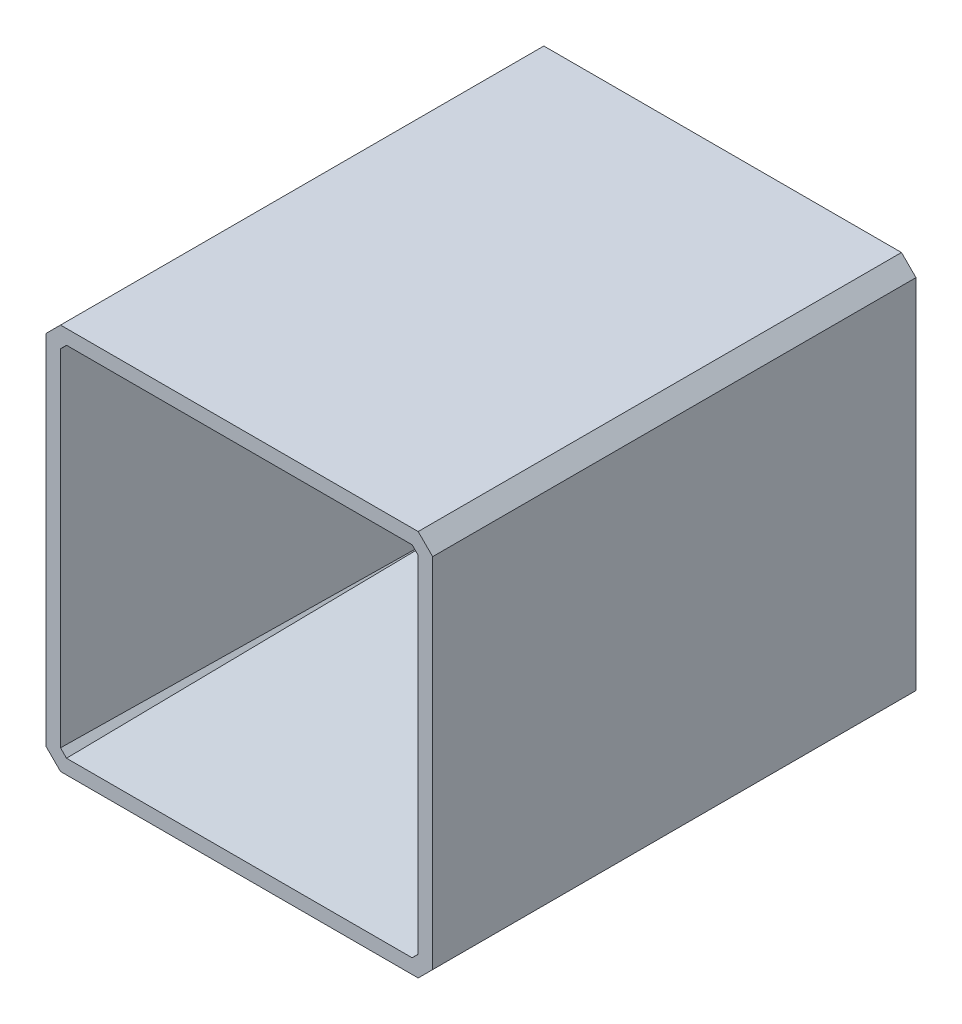
ISO-10303-21;
HEADER;
FILE_DESCRIPTION(('STEP AP214'),'2;1');
FILE_NAME('part.step','',(''),(''),'','','');
FILE_SCHEMA(('AUTOMOTIVE_DESIGN { 1 0 10303 214 1 1 1 1 }'));
ENDSEC;
DATA;
#1=APPLICATION_CONTEXT('core data for automotive mechanical design processes');
#2=APPLICATION_PROTOCOL_DEFINITION('international standard','automotive_design',2000,#1);
#3=PRODUCT_CONTEXT('',#1,'mechanical');
#4=PRODUCT('Part','Part','',(#3));
#5=PRODUCT_RELATED_PRODUCT_CATEGORY('part','',(#4));
#6=PRODUCT_DEFINITION_FORMATION('','',#4);
#7=PRODUCT_DEFINITION_CONTEXT('part definition',#1,'design');
#8=PRODUCT_DEFINITION('design','',#6,#7);
#9=PRODUCT_DEFINITION_SHAPE('','',#8);
#10=(LENGTH_UNIT() NAMED_UNIT(*) SI_UNIT(.MILLI.,.METRE.));
#11=(NAMED_UNIT(*) PLANE_ANGLE_UNIT() SI_UNIT($,.RADIAN.));
#12=(NAMED_UNIT(*) SI_UNIT($,.STERADIAN.) SOLID_ANGLE_UNIT());
#13=UNCERTAINTY_MEASURE_WITH_UNIT(LENGTH_MEASURE(1.E-05),#10,'distance_accuracy_value','');
#14=(GEOMETRIC_REPRESENTATION_CONTEXT(3) GLOBAL_UNCERTAINTY_ASSIGNED_CONTEXT((#13)) GLOBAL_UNIT_ASSIGNED_CONTEXT((#10,
#11,#12)) REPRESENTATION_CONTEXT('',''));
#15=CARTESIAN_POINT('',(0.,0.,0.));
#16=DIRECTION('',(0.,0.,1.));
#17=DIRECTION('',(1.,0.,0.));
#18=AXIS2_PLACEMENT_3D('',#15,#16,#17);
#19=CARTESIAN_POINT('',(40.,40.,100.));
#20=DIRECTION('',(0.,-1.,0.));
#21=DIRECTION('',(0.,0.,-1.));
#22=AXIS2_PLACEMENT_3D('',#19,#20,#21);
#23=PLANE('',#22);
#24=DIRECTION('',(-1.,0.,0.));
#25=VECTOR('',#24,1.);
#26=CARTESIAN_POINT('',(40.,40.,100.));
#27=LINE('',#26,#25);
#28=CARTESIAN_POINT('',(37.,40.,100.));
#29=VERTEX_POINT('',#28);
#30=CARTESIAN_POINT('',(-37.,40.,100.));
#31=VERTEX_POINT('',#30);
#32=EDGE_CURVE('E197',#29,#31,#27,.T.);
#33=ORIENTED_EDGE('',*,*,#32,.F.);
#34=DIRECTION('',(0.,0.,-1.));
#35=VECTOR('',#34,1.);
#36=CARTESIAN_POINT('',(37.,40.,100.));
#37=LINE('',#36,#35);
#38=CARTESIAN_POINT('',(37.,40.,0.));
#39=VERTEX_POINT('',#38);
#40=EDGE_CURVE('E222',#29,#39,#37,.T.);
#41=ORIENTED_EDGE('',*,*,#40,.T.);
#42=DIRECTION('',(-1.,0.,0.));
#43=VECTOR('',#42,1.);
#44=CARTESIAN_POINT('',(40.,40.,0.));
#45=LINE('',#44,#43);
#46=CARTESIAN_POINT('',(-37.,40.,0.));
#47=VERTEX_POINT('',#46);
#48=EDGE_CURVE('E210',#39,#47,#45,.T.);
#49=ORIENTED_EDGE('',*,*,#48,.T.);
#50=DIRECTION('',(0.,0.,1.));
#51=VECTOR('',#50,1.);
#52=CARTESIAN_POINT('',(-37.,40.,100.));
#53=LINE('',#52,#51);
#54=EDGE_CURVE('E209',#47,#31,#53,.T.);
#55=ORIENTED_EDGE('',*,*,#54,.T.);
#56=EDGE_LOOP('',(#33,#41,#49,#55));
#57=FACE_BOUND('',#56,.T.);
#58=ADVANCED_FACE('F45',(#57),#23,.F.);
#59=CARTESIAN_POINT('',(-40.,-40.,100.));
#60=DIRECTION('',(1.,0.,0.));
#61=DIRECTION('',(0.,0.,-1.));
#62=AXIS2_PLACEMENT_3D('',#59,#60,#61);
#63=PLANE('',#62);
#64=DIRECTION('',(0.,-1.,0.));
#65=VECTOR('',#64,1.);
#66=CARTESIAN_POINT('',(-40.,-40.,0.));
#67=LINE('',#66,#65);
#68=CARTESIAN_POINT('',(-40.,37.,0.));
#69=VERTEX_POINT('',#68);
#70=CARTESIAN_POINT('',(-40.,-37.,0.));
#71=VERTEX_POINT('',#70);
#72=EDGE_CURVE('E213',#69,#71,#67,.T.);
#73=ORIENTED_EDGE('',*,*,#72,.T.);
#74=DIRECTION('',(0.,0.,1.));
#75=VECTOR('',#74,1.);
#76=CARTESIAN_POINT('',(-40.,-37.,100.));
#77=LINE('',#76,#75);
#78=CARTESIAN_POINT('',(-40.,-37.,100.));
#79=VERTEX_POINT('',#78);
#80=EDGE_CURVE('E12',#71,#79,#77,.T.);
#81=ORIENTED_EDGE('',*,*,#80,.T.);
#82=DIRECTION('',(0.,-1.,0.));
#83=VECTOR('',#82,1.);
#84=CARTESIAN_POINT('',(-40.,-40.,100.));
#85=LINE('',#84,#83);
#86=CARTESIAN_POINT('',(-40.,37.,100.));
#87=VERTEX_POINT('',#86);
#88=EDGE_CURVE('E200',#87,#79,#85,.T.);
#89=ORIENTED_EDGE('',*,*,#88,.F.);
#90=DIRECTION('',(0.,0.,-1.));
#91=VECTOR('',#90,1.);
#92=CARTESIAN_POINT('',(-40.,37.,100.));
#93=LINE('',#92,#91);
#94=EDGE_CURVE('E54',#87,#69,#93,.T.);
#95=ORIENTED_EDGE('',*,*,#94,.T.);
#96=EDGE_LOOP('',(#73,#81,#89,#95));
#97=FACE_BOUND('',#96,.T.);
#98=ADVANCED_FACE('F254',(#97),#63,.F.);
#99=CARTESIAN_POINT('',(40.,-40.,100.));
#100=DIRECTION('',(0.,1.,0.));
#101=DIRECTION('',(0.,0.,1.));
#102=AXIS2_PLACEMENT_3D('',#99,#100,#101);
#103=PLANE('',#102);
#104=DIRECTION('',(1.,0.,0.));
#105=VECTOR('',#104,1.);
#106=CARTESIAN_POINT('',(40.,-40.,0.));
#107=LINE('',#106,#105);
#108=CARTESIAN_POINT('',(-37.,-40.,0.));
#109=VERTEX_POINT('',#108);
#110=CARTESIAN_POINT('',(37.,-40.,0.));
#111=VERTEX_POINT('',#110);
#112=EDGE_CURVE('E217',#109,#111,#107,.T.);
#113=ORIENTED_EDGE('',*,*,#112,.T.);
#114=DIRECTION('',(0.,0.,1.));
#115=VECTOR('',#114,1.);
#116=CARTESIAN_POINT('',(37.,-40.,100.));
#117=LINE('',#116,#115);
#118=CARTESIAN_POINT('',(37.,-40.,100.));
#119=VERTEX_POINT('',#118);
#120=EDGE_CURVE('E69',#111,#119,#117,.T.);
#121=ORIENTED_EDGE('',*,*,#120,.T.);
#122=DIRECTION('',(1.,0.,0.));
#123=VECTOR('',#122,1.);
#124=CARTESIAN_POINT('',(40.,-40.,100.));
#125=LINE('',#124,#123);
#126=CARTESIAN_POINT('',(-37.,-40.,100.));
#127=VERTEX_POINT('',#126);
#128=EDGE_CURVE('E204',#127,#119,#125,.T.);
#129=ORIENTED_EDGE('',*,*,#128,.F.);
#130=DIRECTION('',(0.,0.,-1.));
#131=VECTOR('',#130,1.);
#132=CARTESIAN_POINT('',(-37.,-40.,100.));
#133=LINE('',#132,#131);
#134=EDGE_CURVE('E246',#127,#109,#133,.T.);
#135=ORIENTED_EDGE('',*,*,#134,.T.);
#136=EDGE_LOOP('',(#113,#121,#129,#135));
#137=FACE_BOUND('',#136,.T.);
#138=ADVANCED_FACE('F266',(#137),#103,.F.);
#139=CARTESIAN_POINT('',(40.,-40.,100.));
#140=DIRECTION('',(-1.,0.,0.));
#141=DIRECTION('',(0.,0.,1.));
#142=AXIS2_PLACEMENT_3D('',#139,#140,#141);
#143=PLANE('',#142);
#144=DIRECTION('',(0.,1.,0.));
#145=VECTOR('',#144,1.);
#146=CARTESIAN_POINT('',(40.,-40.,0.));
#147=LINE('',#146,#145);
#148=CARTESIAN_POINT('',(40.,-37.,0.));
#149=VERTEX_POINT('',#148);
#150=CARTESIAN_POINT('',(40.,37.,0.));
#151=VERTEX_POINT('',#150);
#152=EDGE_CURVE('E201',#149,#151,#147,.T.);
#153=ORIENTED_EDGE('',*,*,#152,.T.);
#154=DIRECTION('',(0.,0.,1.));
#155=VECTOR('',#154,1.);
#156=CARTESIAN_POINT('',(40.,37.,100.));
#157=LINE('',#156,#155);
#158=CARTESIAN_POINT('',(40.,37.,100.));
#159=VERTEX_POINT('',#158);
#160=EDGE_CURVE('E236',#151,#159,#157,.T.);
#161=ORIENTED_EDGE('',*,*,#160,.T.);
#162=DIRECTION('',(0.,1.,0.));
#163=VECTOR('',#162,1.);
#164=CARTESIAN_POINT('',(40.,-40.,100.));
#165=LINE('',#164,#163);
#166=CARTESIAN_POINT('',(40.,-37.,100.));
#167=VERTEX_POINT('',#166);
#168=EDGE_CURVE('E206',#167,#159,#165,.T.);
#169=ORIENTED_EDGE('',*,*,#168,.F.);
#170=DIRECTION('',(0.,0.,-1.));
#171=VECTOR('',#170,1.);
#172=CARTESIAN_POINT('',(40.,-37.,100.));
#173=LINE('',#172,#171);
#174=EDGE_CURVE('E233',#167,#149,#173,.T.);
#175=ORIENTED_EDGE('',*,*,#174,.T.);
#176=EDGE_LOOP('',(#153,#161,#169,#175));
#177=FACE_BOUND('',#176,.T.);
#178=ADVANCED_FACE('F276',(#177),#143,.F.);
#179=CARTESIAN_POINT('',(0.,0.,100.));
#180=DIRECTION('',(0.,0.,-1.));
#181=DIRECTION('',(-1.,0.,0.));
#182=AXIS2_PLACEMENT_3D('',#179,#180,#181);
#183=PLANE('',#182);
#184=DIRECTION('',(1.,0.,0.));
#185=VECTOR('',#184,1.);
#186=CARTESIAN_POINT('',(-35.7573593128807,-37.,100.));
#187=LINE('',#186,#185);
#188=CARTESIAN_POINT('',(-35.7573593128807,-37.,100.));
#189=VERTEX_POINT('',#188);
#190=CARTESIAN_POINT('',(35.7573593128807,-37.,100.));
#191=VERTEX_POINT('',#190);
#192=EDGE_CURVE('E214',#189,#191,#187,.T.);
#193=ORIENTED_EDGE('',*,*,#192,.F.);
#194=DIRECTION('',(0.707106781186547,-0.707106781186547,0.));
#195=VECTOR('',#194,1.);
#196=CARTESIAN_POINT('',(-37.,-35.7573593128807,100.));
#197=LINE('',#196,#195);
#198=CARTESIAN_POINT('',(-37.,-35.7573593128807,100.));
#199=VERTEX_POINT('',#198);
#200=EDGE_CURVE('E465',#199,#189,#197,.T.);
#201=ORIENTED_EDGE('',*,*,#200,.F.);
#202=DIRECTION('',(0.,-1.,0.));
#203=VECTOR('',#202,1.);
#204=CARTESIAN_POINT('',(-37.,35.7573593128807,100.));
#205=LINE('',#204,#203);
#206=CARTESIAN_POINT('',(-37.,35.7573593128807,100.));
#207=VERTEX_POINT('',#206);
#208=EDGE_CURVE('E469',#207,#199,#205,.T.);
#209=ORIENTED_EDGE('',*,*,#208,.F.);
#210=DIRECTION('',(-0.707106781186547,-0.707106781186547,0.));
#211=VECTOR('',#210,1.);
#212=CARTESIAN_POINT('',(-35.7573593128807,37.,100.));
#213=LINE('',#212,#211);
#214=CARTESIAN_POINT('',(-35.7573593128807,37.,100.));
#215=VERTEX_POINT('',#214);
#216=EDGE_CURVE('E476',#215,#207,#213,.T.);
#217=ORIENTED_EDGE('',*,*,#216,.F.);
#218=DIRECTION('',(-1.,0.,0.));
#219=VECTOR('',#218,1.);
#220=CARTESIAN_POINT('',(35.7573593128807,37.,100.));
#221=LINE('',#220,#219);
#222=CARTESIAN_POINT('',(35.7573593128807,37.,100.));
#223=VERTEX_POINT('',#222);
#224=EDGE_CURVE('E479',#223,#215,#221,.T.);
#225=ORIENTED_EDGE('',*,*,#224,.F.);
#226=DIRECTION('',(-0.707106781186547,0.707106781186547,0.));
#227=VECTOR('',#226,1.);
#228=CARTESIAN_POINT('',(37.,35.7573593128807,100.));
#229=LINE('',#228,#227);
#230=CARTESIAN_POINT('',(37.,35.7573593128807,100.));
#231=VERTEX_POINT('',#230);
#232=EDGE_CURVE('E482',#231,#223,#229,.T.);
#233=ORIENTED_EDGE('',*,*,#232,.F.);
#234=DIRECTION('',(0.,1.,0.));
#235=VECTOR('',#234,1.);
#236=CARTESIAN_POINT('',(37.,-35.7573593128807,100.));
#237=LINE('',#236,#235);
#238=CARTESIAN_POINT('',(37.,-35.7573593128807,100.));
#239=VERTEX_POINT('',#238);
#240=EDGE_CURVE('E61',#239,#231,#237,.T.);
#241=ORIENTED_EDGE('',*,*,#240,.F.);
#242=DIRECTION('',(0.707106781186547,0.707106781186547,0.));
#243=VECTOR('',#242,1.);
#244=CARTESIAN_POINT('',(35.7573593128807,-37.,100.));
#245=LINE('',#244,#243);
#246=EDGE_CURVE('E186',#191,#239,#245,.T.);
#247=ORIENTED_EDGE('',*,*,#246,.F.);
#248=EDGE_LOOP('',(#193,#201,#209,#217,#225,#233,#241,#247));
#249=FACE_BOUND('',#248,.T.);
#250=ORIENTED_EDGE('',*,*,#168,.T.);
#251=DIRECTION('',(0.707106781186546,-0.707106781186549,0.));
#252=VECTOR('',#251,1.);
#253=CARTESIAN_POINT('',(37.,40.,100.));
#254=LINE('',#253,#252);
#255=EDGE_CURVE('E244',#159,#29,#254,.F.);
#256=ORIENTED_EDGE('',*,*,#255,.T.);
#257=ORIENTED_EDGE('',*,*,#32,.T.);
#258=DIRECTION('',(0.707106781186549,0.707106781186546,0.));
#259=VECTOR('',#258,1.);
#260=CARTESIAN_POINT('',(-40.,37.,100.));
#261=LINE('',#260,#259);
#262=EDGE_CURVE('E238',#31,#87,#261,.F.);
#263=ORIENTED_EDGE('',*,*,#262,.T.);
#264=ORIENTED_EDGE('',*,*,#88,.T.);
#265=DIRECTION('',(-0.707106781186548,0.707106781186548,0.));
#266=VECTOR('',#265,1.);
#267=CARTESIAN_POINT('',(-37.,-40.,100.));
#268=LINE('',#267,#266);
#269=EDGE_CURVE('E240',#79,#127,#268,.F.);
#270=ORIENTED_EDGE('',*,*,#269,.T.);
#271=ORIENTED_EDGE('',*,*,#128,.T.);
#272=DIRECTION('',(-0.707106781186549,-0.707106781186546,0.));
#273=VECTOR('',#272,1.);
#274=CARTESIAN_POINT('',(40.,-37.,100.));
#275=LINE('',#274,#273);
#276=EDGE_CURVE('E242',#119,#167,#275,.F.);
#277=ORIENTED_EDGE('',*,*,#276,.T.);
#278=EDGE_LOOP('',(#250,#256,#257,#263,#264,#270,#271,#277));
#279=FACE_BOUND('',#278,.T.);
#280=ADVANCED_FACE('F269',(#249,#279),#183,.F.);
#281=CARTESIAN_POINT('',(0.,0.,0.));
#282=DIRECTION('',(0.,0.,-1.));
#283=DIRECTION('',(-1.,0.,0.));
#284=AXIS2_PLACEMENT_3D('',#281,#282,#283);
#285=PLANE('',#284);
#286=ORIENTED_EDGE('',*,*,#48,.F.);
#287=DIRECTION('',(-0.707106781186546,0.707106781186549,0.));
#288=VECTOR('',#287,1.);
#289=CARTESIAN_POINT('',(38.5000000000001,38.4999999999999,0.));
#290=LINE('',#289,#288);
#291=EDGE_CURVE('E231',#39,#151,#290,.F.);
#292=ORIENTED_EDGE('',*,*,#291,.T.);
#293=ORIENTED_EDGE('',*,*,#152,.F.);
#294=DIRECTION('',(0.707106781186549,0.707106781186546,0.));
#295=VECTOR('',#294,1.);
#296=CARTESIAN_POINT('',(38.4999999999999,-38.5000000000001,0.));
#297=LINE('',#296,#295);
#298=EDGE_CURVE('E229',#149,#111,#297,.F.);
#299=ORIENTED_EDGE('',*,*,#298,.T.);
#300=ORIENTED_EDGE('',*,*,#112,.F.);
#301=DIRECTION('',(0.707106781186548,-0.707106781186548,0.));
#302=VECTOR('',#301,1.);
#303=CARTESIAN_POINT('',(-38.5,-38.5,0.));
#304=LINE('',#303,#302);
#305=EDGE_CURVE('E227',#109,#71,#304,.F.);
#306=ORIENTED_EDGE('',*,*,#305,.T.);
#307=ORIENTED_EDGE('',*,*,#72,.F.);
#308=DIRECTION('',(-0.707106781186549,-0.707106781186546,0.));
#309=VECTOR('',#308,1.);
#310=CARTESIAN_POINT('',(-38.4999999999999,38.5000000000001,0.));
#311=LINE('',#310,#309);
#312=EDGE_CURVE('E225',#69,#47,#311,.F.);
#313=ORIENTED_EDGE('',*,*,#312,.T.);
#314=EDGE_LOOP('',(#286,#292,#293,#299,#300,#306,#307,#313));
#315=FACE_BOUND('',#314,.T.);
#316=ADVANCED_FACE('F260',(#315),#285,.T.);
#317=CARTESIAN_POINT('',(37.,40.,100.));
#318=DIRECTION('',(-0.707106781186549,-0.707106781186546,0.));
#319=DIRECTION('',(0.,0.,-1.));
#320=AXIS2_PLACEMENT_3D('',#317,#318,#319);
#321=PLANE('',#320);
#322=ORIENTED_EDGE('',*,*,#255,.F.);
#323=ORIENTED_EDGE('',*,*,#160,.F.);
#324=ORIENTED_EDGE('',*,*,#291,.F.);
#325=ORIENTED_EDGE('',*,*,#40,.F.);
#326=EDGE_LOOP('',(#322,#323,#324,#325));
#327=FACE_BOUND('',#326,.T.);
#328=ADVANCED_FACE('F281',(#327),#321,.F.);
#329=CARTESIAN_POINT('',(40.,-37.,100.));
#330=DIRECTION('',(-0.707106781186546,0.707106781186549,0.));
#331=DIRECTION('',(0.,0.,-1.));
#332=AXIS2_PLACEMENT_3D('',#329,#330,#331);
#333=PLANE('',#332);
#334=ORIENTED_EDGE('',*,*,#276,.F.);
#335=ORIENTED_EDGE('',*,*,#120,.F.);
#336=ORIENTED_EDGE('',*,*,#298,.F.);
#337=ORIENTED_EDGE('',*,*,#174,.F.);
#338=EDGE_LOOP('',(#334,#335,#336,#337));
#339=FACE_BOUND('',#338,.T.);
#340=ADVANCED_FACE('F273',(#339),#333,.F.);
#341=CARTESIAN_POINT('',(-37.,-40.,100.));
#342=DIRECTION('',(0.707106781186547,0.707106781186547,0.));
#343=DIRECTION('',(0.,0.,-1.));
#344=AXIS2_PLACEMENT_3D('',#341,#342,#343);
#345=PLANE('',#344);
#346=ORIENTED_EDGE('',*,*,#269,.F.);
#347=ORIENTED_EDGE('',*,*,#80,.F.);
#348=ORIENTED_EDGE('',*,*,#305,.F.);
#349=ORIENTED_EDGE('',*,*,#134,.F.);
#350=EDGE_LOOP('',(#346,#347,#348,#349));
#351=FACE_BOUND('',#350,.T.);
#352=ADVANCED_FACE('F265',(#351),#345,.F.);
#353=CARTESIAN_POINT('',(-40.,37.,100.));
#354=DIRECTION('',(0.707106781186546,-0.707106781186549,0.));
#355=DIRECTION('',(0.,0.,-1.));
#356=AXIS2_PLACEMENT_3D('',#353,#354,#355);
#357=PLANE('',#356);
#358=ORIENTED_EDGE('',*,*,#262,.F.);
#359=ORIENTED_EDGE('',*,*,#54,.F.);
#360=ORIENTED_EDGE('',*,*,#312,.F.);
#361=ORIENTED_EDGE('',*,*,#94,.F.);
#362=EDGE_LOOP('',(#358,#359,#360,#361));
#363=FACE_BOUND('',#362,.T.);
#364=ADVANCED_FACE('F48',(#363),#357,.F.);
#365=CARTESIAN_POINT('',(-35.7573593128807,-37.,100.));
#366=DIRECTION('',(0.,-0.999657324975557,-0.0261769483078732));
#367=DIRECTION('',(0.,0.0261769483078732,-0.999657324975557));
#368=AXIS2_PLACEMENT_3D('',#365,#366,#367);
#369=PLANE('',#368);
#370=DIRECTION('',(-0.0261679842649794,-0.0261679842649794,0.99931500198837));
#371=VECTOR('',#370,1.);
#372=CARTESIAN_POINT('',(-36.9501784232261,-36.9501784232261,98.0973907432555));
#373=LINE('',#372,#371);
#374=CARTESIAN_POINT('',(-34.4599656077889,-34.4599656077889,3.));
#375=VERTEX_POINT('',#374);
#376=CARTESIAN_POINT('',(-34.8786796564403,-34.8786796564403,18.9900444040193));
#377=VERTEX_POINT('',#376);
#378=EDGE_CURVE('E191',#375,#377,#373,.T.);
#379=ORIENTED_EDGE('',*,*,#378,.T.);
#380=DIRECTION('',(-0.0108422096845632,-0.0261754096665653,0.999598566634598));
#381=VECTOR('',#380,1.);
#382=CARTESIAN_POINT('',(-35.7571527291236,-36.999501262692,99.9809539906128));
#383=LINE('',#382,#381);
#384=EDGE_CURVE('E488',#377,#189,#383,.T.);
#385=ORIENTED_EDGE('',*,*,#384,.T.);
#386=ORIENTED_EDGE('',*,*,#192,.T.);
#387=DIRECTION('',(0.0108422096845632,-0.0261754096665653,0.999598566634598));
#388=VECTOR('',#387,1.);
#389=CARTESIAN_POINT('',(35.7489525066292,-36.9797041743314,99.2249336875563));
#390=LINE('',#389,#388);
#391=CARTESIAN_POINT('',(34.8786796564404,-34.8786796564404,18.9900444040202));
#392=VERTEX_POINT('',#391);
#393=EDGE_CURVE('E192',#392,#191,#390,.T.);
#394=ORIENTED_EDGE('',*,*,#393,.F.);
#395=DIRECTION('',(0.0261679842649794,-0.0261679842649794,0.99931500198837));
#396=VECTOR('',#395,1.);
#397=CARTESIAN_POINT('',(36.9501784232261,-36.9501784232261,98.0973907432555));
#398=LINE('',#397,#396);
#399=CARTESIAN_POINT('',(34.4599656077889,-34.4599656077889,3.));
#400=VERTEX_POINT('',#399);
#401=EDGE_CURVE('E189',#400,#392,#398,.T.);
#402=ORIENTED_EDGE('',*,*,#401,.F.);
#403=DIRECTION('',(1.,0.,0.));
#404=VECTOR('',#403,1.);
#405=CARTESIAN_POINT('',(-35.7573593128807,-34.4599656077889,3.));
#406=LINE('',#405,#404);
#407=EDGE_CURVE('E179',#375,#400,#406,.T.);
#408=ORIENTED_EDGE('',*,*,#407,.F.);
#409=EDGE_LOOP('',(#379,#385,#386,#394,#402,#408));
#410=FACE_BOUND('',#409,.T.);
#411=ADVANCED_FACE('F286',(#410),#369,.F.);
#412=CARTESIAN_POINT('',(-37.,35.7573593128807,100.));
#413=DIRECTION('',(-0.999657324975557,0.,-0.0261769483078732));
#414=DIRECTION('',(-0.0261769483078732,0.,0.999657324975557));
#415=AXIS2_PLACEMENT_3D('',#412,#413,#414);
#416=PLANE('',#415);
#417=DIRECTION('',(-0.0261679842649794,0.0261679842649794,0.99931500198837));
#418=VECTOR('',#417,1.);
#419=CARTESIAN_POINT('',(-36.9501784232261,36.9501784232261,98.0973907432555));
#420=LINE('',#419,#418);
#421=CARTESIAN_POINT('',(-34.4599656077889,34.4599656077889,3.));
#422=VERTEX_POINT('',#421);
#423=CARTESIAN_POINT('',(-34.8786796564403,34.8786796564403,18.9900444040202));
#424=VERTEX_POINT('',#423);
#425=EDGE_CURVE('E167',#422,#424,#420,.T.);
#426=ORIENTED_EDGE('',*,*,#425,.T.);
#427=DIRECTION('',(-0.0261754096665653,0.0108422096845632,0.999598566634598));
#428=VECTOR('',#427,1.);
#429=CARTESIAN_POINT('',(-36.999501262692,35.7571527291236,99.9809539906128));
#430=LINE('',#429,#428);
#431=EDGE_CURVE('E486',#424,#207,#430,.T.);
#432=ORIENTED_EDGE('',*,*,#431,.T.);
#433=ORIENTED_EDGE('',*,*,#208,.T.);
#434=DIRECTION('',(-0.0261754096665653,-0.0108422096845632,0.999598566634598));
#435=VECTOR('',#434,1.);
#436=CARTESIAN_POINT('',(-36.9797041743314,-35.7489525066292,99.2249336875563));
#437=LINE('',#436,#435);
#438=EDGE_CURVE('E171',#377,#199,#437,.T.);
#439=ORIENTED_EDGE('',*,*,#438,.F.);
#440=ORIENTED_EDGE('',*,*,#378,.F.);
#441=DIRECTION('',(0.,-1.,0.));
#442=VECTOR('',#441,1.);
#443=CARTESIAN_POINT('',(-34.4599656077889,35.7573593128807,3.));
#444=LINE('',#443,#442);
#445=EDGE_CURVE('E190',#422,#375,#444,.T.);
#446=ORIENTED_EDGE('',*,*,#445,.F.);
#447=EDGE_LOOP('',(#426,#432,#433,#439,#440,#446));
#448=FACE_BOUND('',#447,.T.);
#449=ADVANCED_FACE('F292',(#448),#416,.F.);
#450=CARTESIAN_POINT('',(35.7573593128807,37.,100.));
#451=DIRECTION('',(0.,0.999657324975557,-0.0261769483078732));
#452=DIRECTION('',(0.,0.0261769483078732,0.999657324975557));
#453=AXIS2_PLACEMENT_3D('',#450,#451,#452);
#454=PLANE('',#453);
#455=DIRECTION('',(0.0261679842649794,0.0261679842649794,0.99931500198837));
#456=VECTOR('',#455,1.);
#457=CARTESIAN_POINT('',(36.9501784232261,36.9501784232261,98.0973907432555));
#458=LINE('',#457,#456);
#459=CARTESIAN_POINT('',(34.4599656077889,34.4599656077888,3.));
#460=VERTEX_POINT('',#459);
#461=CARTESIAN_POINT('',(34.8786796564404,34.8786796564403,18.9900444040202));
#462=VERTEX_POINT('',#461);
#463=EDGE_CURVE('E164',#460,#462,#458,.T.);
#464=ORIENTED_EDGE('',*,*,#463,.T.);
#465=DIRECTION('',(0.0108422096845632,0.0261754096665653,0.999598566634598));
#466=VECTOR('',#465,1.);
#467=CARTESIAN_POINT('',(35.7571527291237,36.999501262692,99.9809539906128));
#468=LINE('',#467,#466);
#469=EDGE_CURVE('E484',#462,#223,#468,.T.);
#470=ORIENTED_EDGE('',*,*,#469,.T.);
#471=ORIENTED_EDGE('',*,*,#224,.T.);
#472=DIRECTION('',(-0.0108422096845632,0.0261754096665653,0.999598566634598));
#473=VECTOR('',#472,1.);
#474=CARTESIAN_POINT('',(-35.7489525066292,36.9797041743314,99.2249336875563));
#475=LINE('',#474,#473);
#476=EDGE_CURVE('E181',#424,#215,#475,.T.);
#477=ORIENTED_EDGE('',*,*,#476,.F.);
#478=ORIENTED_EDGE('',*,*,#425,.F.);
#479=DIRECTION('',(-1.,0.,0.));
#480=VECTOR('',#479,1.);
#481=CARTESIAN_POINT('',(35.7573593128807,34.4599656077889,3.));
#482=LINE('',#481,#480);
#483=EDGE_CURVE('E161',#460,#422,#482,.T.);
#484=ORIENTED_EDGE('',*,*,#483,.F.);
#485=EDGE_LOOP('',(#464,#470,#471,#477,#478,#484));
#486=FACE_BOUND('',#485,.T.);
#487=ADVANCED_FACE('F163',(#486),#454,.F.);
#488=CARTESIAN_POINT('',(37.,-35.7573593128807,100.));
#489=DIRECTION('',(0.999657324975557,0.,-0.0261769483078732));
#490=DIRECTION('',(-0.0261769483078732,0.,-0.999657324975557));
#491=AXIS2_PLACEMENT_3D('',#488,#489,#490);
#492=PLANE('',#491);
#493=ORIENTED_EDGE('',*,*,#401,.T.);
#494=DIRECTION('',(0.0261754096665653,-0.0108422096845632,0.999598566634598));
#495=VECTOR('',#494,1.);
#496=CARTESIAN_POINT('',(36.999501262692,-35.7571527291237,99.9809539906128));
#497=LINE('',#496,#495);
#498=EDGE_CURVE('E491',#392,#239,#497,.T.);
#499=ORIENTED_EDGE('',*,*,#498,.T.);
#500=ORIENTED_EDGE('',*,*,#240,.T.);
#501=DIRECTION('',(0.0261754096665653,0.0108422096845632,0.999598566634598));
#502=VECTOR('',#501,1.);
#503=CARTESIAN_POINT('',(36.9797041743314,35.7489525066292,99.2249336875563));
#504=LINE('',#503,#502);
#505=EDGE_CURVE('E176',#462,#231,#504,.T.);
#506=ORIENTED_EDGE('',*,*,#505,.F.);
#507=ORIENTED_EDGE('',*,*,#463,.F.);
#508=DIRECTION('',(0.,1.,0.));
#509=VECTOR('',#508,1.);
#510=CARTESIAN_POINT('',(34.4599656077889,-35.7573593128807,3.));
#511=LINE('',#510,#509);
#512=EDGE_CURVE('E174',#400,#460,#511,.T.);
#513=ORIENTED_EDGE('',*,*,#512,.F.);
#514=EDGE_LOOP('',(#493,#499,#500,#506,#507,#513));
#515=FACE_BOUND('',#514,.T.);
#516=ADVANCED_FACE('F173',(#515),#492,.F.);
#517=CARTESIAN_POINT('',(35.7573593128807,-37.,100.));
#518=DIRECTION('',(0.706864473353021,-0.706864473353021,-0.0261769483078732));
#519=DIRECTION('',(0.707106781186548,0.707106781186548,0.));
#520=AXIS2_PLACEMENT_3D('',#517,#518,#519);
#521=PLANE('',#520);
#522=ORIENTED_EDGE('',*,*,#246,.T.);
#523=ORIENTED_EDGE('',*,*,#498,.F.);
#524=ORIENTED_EDGE('',*,*,#393,.T.);
#525=EDGE_LOOP('',(#522,#523,#524));
#526=FACE_BOUND('',#525,.T.);
#527=ADVANCED_FACE('F364',(#526),#521,.F.);
#528=CARTESIAN_POINT('',(-37.,-35.7573593128807,100.));
#529=DIRECTION('',(-0.706864473353021,-0.706864473353021,-0.0261769483078732));
#530=DIRECTION('',(0.707106781186548,-0.707106781186548,0.));
#531=AXIS2_PLACEMENT_3D('',#528,#529,#530);
#532=PLANE('',#531);
#533=ORIENTED_EDGE('',*,*,#200,.T.);
#534=ORIENTED_EDGE('',*,*,#384,.F.);
#535=ORIENTED_EDGE('',*,*,#438,.T.);
#536=EDGE_LOOP('',(#533,#534,#535));
#537=FACE_BOUND('',#536,.T.);
#538=ADVANCED_FACE('F373',(#537),#532,.F.);
#539=CARTESIAN_POINT('',(-35.7573593128807,37.,100.));
#540=DIRECTION('',(-0.706864473353021,0.706864473353021,-0.0261769483078732));
#541=DIRECTION('',(-0.707106781186548,-0.707106781186548,0.));
#542=AXIS2_PLACEMENT_3D('',#539,#540,#541);
#543=PLANE('',#542);
#544=ORIENTED_EDGE('',*,*,#216,.T.);
#545=ORIENTED_EDGE('',*,*,#431,.F.);
#546=ORIENTED_EDGE('',*,*,#476,.T.);
#547=EDGE_LOOP('',(#544,#545,#546));
#548=FACE_BOUND('',#547,.T.);
#549=ADVANCED_FACE('F383',(#548),#543,.F.);
#550=CARTESIAN_POINT('',(37.,35.7573593128807,100.));
#551=DIRECTION('',(0.706864473353021,0.706864473353021,-0.0261769483078732));
#552=DIRECTION('',(-0.707106781186548,0.707106781186548,0.));
#553=AXIS2_PLACEMENT_3D('',#550,#551,#552);
#554=PLANE('',#553);
#555=ORIENTED_EDGE('',*,*,#232,.T.);
#556=ORIENTED_EDGE('',*,*,#469,.F.);
#557=ORIENTED_EDGE('',*,*,#505,.T.);
#558=EDGE_LOOP('',(#555,#556,#557));
#559=FACE_BOUND('',#558,.T.);
#560=ADVANCED_FACE('F393',(#559),#554,.F.);
#561=CARTESIAN_POINT('',(0.,0.,3.));
#562=DIRECTION('',(0.,0.,-1.));
#563=DIRECTION('',(-1.,0.,0.));
#564=AXIS2_PLACEMENT_3D('',#561,#562,#563);
#565=PLANE('',#564);
#566=ORIENTED_EDGE('',*,*,#407,.T.);
#567=ORIENTED_EDGE('',*,*,#512,.T.);
#568=ORIENTED_EDGE('',*,*,#483,.T.);
#569=ORIENTED_EDGE('',*,*,#445,.T.);
#570=EDGE_LOOP('',(#566,#567,#568,#569));
#571=FACE_BOUND('',#570,.T.);
#572=ADVANCED_FACE('F178',(#571),#565,.F.);
#573=CLOSED_SHELL('',(#58,#98,#138,#178,#280,#316,#328,#340,#352,#364,#411,#449,#487,#516,#527,
#538,#549,#560,#572));
#574=MANIFOLD_SOLID_BREP('B2',#573);
#575=ADVANCED_BREP_SHAPE_REPRESENTATION('',(#18,#574),#14);
#576=SHAPE_DEFINITION_REPRESENTATION(#9,#575);
ENDSEC;
END-ISO-10303-21;
